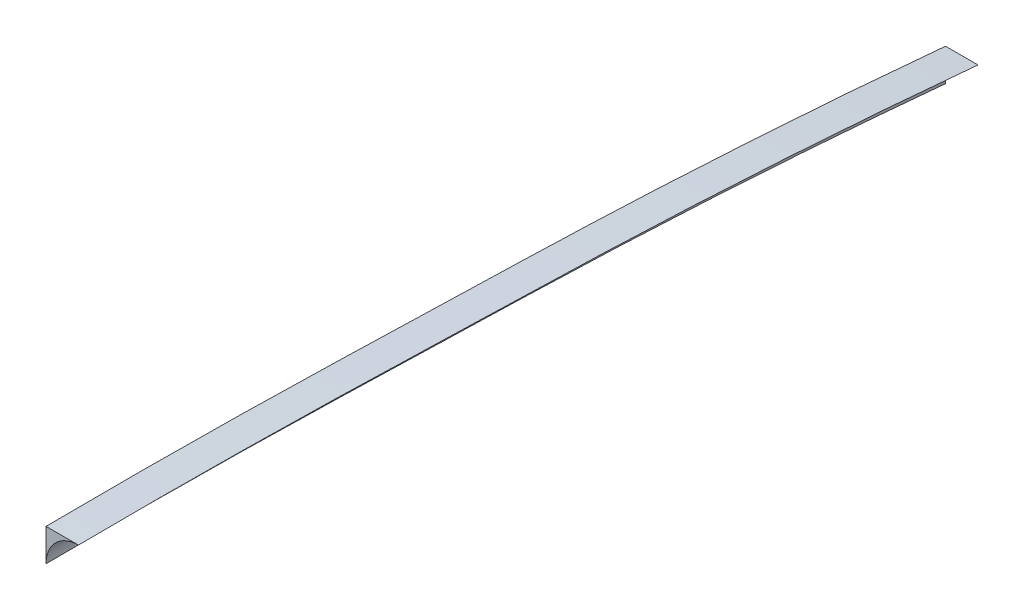
ISO-10303-21;
HEADER;
FILE_DESCRIPTION(('STEP AP214'),'2;1');
FILE_NAME('part.step','',(''),(''),'','','');
FILE_SCHEMA(('AUTOMOTIVE_DESIGN { 1 0 10303 214 1 1 1 1 }'));
ENDSEC;
DATA;
#1=APPLICATION_CONTEXT('core data for automotive mechanical design processes');
#2=APPLICATION_PROTOCOL_DEFINITION('international standard','automotive_design',2000,#1);
#3=PRODUCT_CONTEXT('',#1,'mechanical');
#4=PRODUCT('Part','Part','',(#3));
#5=PRODUCT_RELATED_PRODUCT_CATEGORY('part','',(#4));
#6=PRODUCT_DEFINITION_FORMATION('','',#4);
#7=PRODUCT_DEFINITION_CONTEXT('part definition',#1,'design');
#8=PRODUCT_DEFINITION('design','',#6,#7);
#9=PRODUCT_DEFINITION_SHAPE('','',#8);
#10=(LENGTH_UNIT() NAMED_UNIT(*) SI_UNIT(.MILLI.,.METRE.));
#11=(NAMED_UNIT(*) PLANE_ANGLE_UNIT() SI_UNIT($,.RADIAN.));
#12=(NAMED_UNIT(*) SI_UNIT($,.STERADIAN.) SOLID_ANGLE_UNIT());
#13=UNCERTAINTY_MEASURE_WITH_UNIT(LENGTH_MEASURE(1.E-05),#10,'distance_accuracy_value','');
#14=(GEOMETRIC_REPRESENTATION_CONTEXT(3) GLOBAL_UNCERTAINTY_ASSIGNED_CONTEXT((#13)) GLOBAL_UNIT_ASSIGNED_CONTEXT((#10,
#11,#12)) REPRESENTATION_CONTEXT('',''));
#15=CARTESIAN_POINT('',(0.,0.,0.));
#16=DIRECTION('',(0.,0.,1.));
#17=DIRECTION('',(1.,0.,0.));
#18=AXIS2_PLACEMENT_3D('',#15,#16,#17);
#19=CARTESIAN_POINT('',(545.921789204401,117.985789350297,0.));
#20=DIRECTION('',(0.,0.,-1.));
#21=DIRECTION('',(-1.,0.,0.));
#22=AXIS2_PLACEMENT_3D('',#19,#20,#21);
#23=PLANE('',#22);
#24=DIRECTION('',(0.,-1.,0.));
#25=VECTOR('',#24,1.);
#26=CARTESIAN_POINT('',(469.721789204401,194.185789350297,0.));
#27=LINE('',#26,#25);
#28=CARTESIAN_POINT('',(469.721789204401,194.185789350297,0.));
#29=VERTEX_POINT('',#28);
#30=CARTESIAN_POINT('',(469.721789204401,117.985789350297,0.));
#31=VERTEX_POINT('',#30);
#32=EDGE_CURVE('E294',#29,#31,#27,.T.);
#33=ORIENTED_EDGE('',*,*,#32,.T.);
#34=CARTESIAN_POINT('',(545.921789204401,117.985789350297,0.));
#35=DIRECTION('',(0.,0.,-1.));
#36=DIRECTION('',(-1.,0.,0.));
#37=AXIS2_PLACEMENT_3D('',#34,#35,#36);
#38=CIRCLE('',#37,76.2);
#39=CARTESIAN_POINT('',(545.921789204401,194.185789350297,0.));
#40=VERTEX_POINT('',#39);
#41=EDGE_CURVE('E69',#31,#40,#38,.T.);
#42=ORIENTED_EDGE('',*,*,#41,.T.);
#43=DIRECTION('',(1.,0.,0.));
#44=VECTOR('',#43,1.);
#45=CARTESIAN_POINT('',(469.721789204401,194.185789350297,0.));
#46=LINE('',#45,#44);
#47=EDGE_CURVE('E13',#29,#40,#46,.T.);
#48=ORIENTED_EDGE('',*,*,#47,.F.);
#49=EDGE_LOOP('',(#33,#42,#48));
#50=FACE_BOUND('',#49,.T.);
#51=ADVANCED_FACE('F59',(#50),#23,.F.);
#52=CARTESIAN_POINT('',(606.952202442193,99.1964787102207,-2052.91158045471));
#53=DIRECTION('',(0.,0.,-1.));
#54=DIRECTION('',(-1.,0.,0.));
#55=AXIS2_PLACEMENT_3D('',#52,#53,#54);
#56=PLANE('',#55);
#57=DIRECTION('',(0.,1.,0.));
#58=VECTOR('',#57,1.);
#59=CARTESIAN_POINT('',(530.752202442193,99.1964787102207,-2052.91158045471));
#60=LINE('',#59,#58);
#61=CARTESIAN_POINT('',(530.752202442193,99.1964787102207,-2052.91158045471));
#62=VERTEX_POINT('',#61);
#63=CARTESIAN_POINT('',(530.752202442193,175.396478710221,-2052.91158045471));
#64=VERTEX_POINT('',#63);
#65=EDGE_CURVE('E113',#62,#64,#60,.T.);
#66=ORIENTED_EDGE('',*,*,#65,.T.);
#67=DIRECTION('',(1.,0.,0.));
#68=VECTOR('',#67,1.);
#69=CARTESIAN_POINT('',(530.752202442193,175.396478710221,-2052.91158045471));
#70=LINE('',#69,#68);
#71=CARTESIAN_POINT('',(606.952202442193,175.396478710221,-2052.91158045471));
#72=VERTEX_POINT('',#71);
#73=EDGE_CURVE('E115',#64,#72,#70,.T.);
#74=ORIENTED_EDGE('',*,*,#73,.T.);
#75=CARTESIAN_POINT('',(606.952202442193,99.1964787102207,-2052.91158045471));
#76=DIRECTION('',(0.,0.,-1.));
#77=DIRECTION('',(-1.,0.,0.));
#78=AXIS2_PLACEMENT_3D('',#75,#76,#77);
#79=CIRCLE('',#78,76.2);
#80=EDGE_CURVE('E109',#62,#72,#79,.T.);
#81=ORIENTED_EDGE('',*,*,#80,.F.);
#82=EDGE_LOOP('',(#66,#74,#81));
#83=FACE_BOUND('',#82,.T.);
#84=ADVANCED_FACE('F112',(#83),#56,.T.);
#85=CARTESIAN_POINT('',(606.952202442193,175.396478710221,-2052.91158045471));
#86=CARTESIAN_POINT('',(597.464547328168,196.648576170798,-1733.7704175225));
#87=CARTESIAN_POINT('',(587.953483294164,207.342137513869,-1413.8418366398));
#88=CARTESIAN_POINT('',(578.365977115273,207.456856747076,-1091.3419317868));
#89=CARTESIAN_POINT('',(574.252610761736,207.469413360218,-952.978499952785));
#90=CARTESIAN_POINT('',(570.139262892897,207.457359859277,-814.615689898086));
#91=CARTESIAN_POINT('',(565.412403861013,207.457360723041,-655.615887489399));
#92=CARTESIAN_POINT('',(564.03103429574,207.391875988301,-609.150044854702));
#93=CARTESIAN_POINT('',(561.976860409547,206.997951277331,-540.052735242805));
#94=CARTESIAN_POINT('',(559.89645176314,206.307770136156,-470.072953430643));
#95=CARTESIAN_POINT('',(557.815264149407,205.337340078487,-400.066969091578));
#96=CARTESIAN_POINT('',(555.079753007234,203.68048595181,-308.051165751863));
#97=CARTESIAN_POINT('',(552.285906540067,201.410223066285,-214.073106909113));
#98=CARTESIAN_POINT('',(549.041099165567,198.102742954017,-104.925842749162));
#99=CARTESIAN_POINT('',(547.127324650602,195.790355069093,-40.5512194143467));
#100=CARTESIAN_POINT('',(545.921789204401,194.185789350297,0.));
#101=CARTESIAN_POINT('',(600.602202442193,175.396478710221,-2052.91158045471));
#102=CARTESIAN_POINT('',(591.117263261857,196.642492550902,-1733.86177478892));
#103=CARTESIAN_POINT('',(581.608928578862,207.336024740864,-1414.02500249796));
#104=CARTESIAN_POINT('',(572.02416240063,207.456830018415,-1091.6172644645));
#105=CARTESIAN_POINT('',(567.911973035203,207.47005277956,-953.293423588407));
#106=CARTESIAN_POINT('',(563.799803135119,207.457359918537,-814.97023747805));
#107=CARTESIAN_POINT('',(559.074297212659,207.457360710331,-656.01595031099));
#108=CARTESIAN_POINT('',(557.692153066331,207.393096054147,-609.524052692682));
#109=CARTESIAN_POINT('',(555.635317012544,206.999940469849,-540.337194372342));
#110=CARTESIAN_POINT('',(553.554427471305,206.311068899495,-470.341236451933));
#111=CARTESIAN_POINT('',(551.472823355752,205.341162454095,-400.321242025717));
#112=CARTESIAN_POINT('',(548.733478292003,203.683075454838,-308.176475082699));
#113=CARTESIAN_POINT('',(545.940675883788,201.414447250556,-214.233535790984));
#114=CARTESIAN_POINT('',(542.691319305683,198.10285752594,-104.933247716103));
#115=CARTESIAN_POINT('',(540.777974415768,195.791036470393,-40.5730759013682));
#116=CARTESIAN_POINT('',(539.571789204401,194.185789350297,0.));
#117=CARTESIAN_POINT('',(587.902202442192,175.396478710221,-2052.91158045471));
#118=CARTESIAN_POINT('',(578.422695129234,196.630325311112,-1734.04448932174));
#119=CARTESIAN_POINT('',(568.919819148257,207.323799194853,-1414.39133421427));
#120=CARTESIAN_POINT('',(559.340532971343,207.456776561093,-1092.16792981989));
#121=CARTESIAN_POINT('',(555.230697582137,207.471331618244,-953.92327085965));
#122=CARTESIAN_POINT('',(551.120883619562,207.457360037057,-815.679332637977));
#123=CARTESIAN_POINT('',(546.398083915949,207.457360684912,-656.816075954172));
#124=CARTESIAN_POINT('',(545.014390607512,207.395536185838,-610.272068368642));
#125=CARTESIAN_POINT('',(542.952230218539,207.003918854886,-540.906112631415));
#126=CARTESIAN_POINT('',(540.870378887634,206.317666426173,-470.877802494514));
#127=CARTESIAN_POINT('',(538.787941768443,205.348807205312,-400.829787893996));
#128=CARTESIAN_POINT('',(536.040928861542,203.688254460892,-308.427093744372));
#129=CARTESIAN_POINT('',(533.25021457123,201.422895619096,-214.554393554726));
#130=CARTESIAN_POINT('',(529.991759585914,198.103086669787,-104.948057649984));
#131=CARTESIAN_POINT('',(528.079273946101,195.792399272991,-40.6167888754111));
#132=CARTESIAN_POINT('',(526.871789204401,194.185789350297,0.));
#133=CARTESIAN_POINT('',(568.852202442193,175.39647871022,-2052.91158045471));
#134=CARTESIAN_POINT('',(559.380842930301,196.612074451425,-1734.31856112098));
#135=CARTESIAN_POINT('',(549.886155002349,207.305460875837,-1414.94083178873));
#136=CARTESIAN_POINT('',(540.315088827412,207.456696375109,-1092.99392785298));
#137=CARTESIAN_POINT('',(536.208784402539,207.47324987627,-954.868041766516));
#138=CARTESIAN_POINT('',(532.102504346226,207.457360214836,-816.742975377869));
#139=CARTESIAN_POINT('',(527.383763970884,207.457360646782,-658.016264418945));
#140=CARTESIAN_POINT('',(525.997746919284,207.399196383374,-611.394091882581));
#141=CARTESIAN_POINT('',(523.927600027532,207.00988643244,-541.759490020026));
#142=CARTESIAN_POINT('',(521.844306012129,206.32756271619,-471.682651558386));
#143=CARTESIAN_POINT('',(519.760619387479,205.360274332136,-401.592606696413));
#144=CARTESIAN_POINT('',(517.002104715849,203.696022969975,-308.803021736881));
#145=CARTESIAN_POINT('',(514.214522602392,201.435568171907,-215.035680200339));
#146=CARTESIAN_POINT('',(510.94242000626,198.103430385556,-104.970272550805));
#147=CARTESIAN_POINT('',(509.0312232416,195.794443476888,-40.6823583364756));
#148=CARTESIAN_POINT('',(507.821789204401,194.185789350297,0.));
#149=CARTESIAN_POINT('',(549.802202442192,175.396478710221,-2052.91158045471));
#150=CARTESIAN_POINT('',(540.338990731367,196.593823591739,-1734.59263292021));
#151=CARTESIAN_POINT('',(530.852490856442,207.287122556821,-1415.4903293632));
#152=CARTESIAN_POINT('',(521.289644683482,207.456616189126,-1093.81992588607));
#153=CARTESIAN_POINT('',(517.186871222941,207.475168134296,-955.81281267338));
#154=CARTESIAN_POINT('',(513.084125072892,207.457360392616,-817.80661811776));
#155=CARTESIAN_POINT('',(508.36944402582,207.457360608653,-659.216452883718));
#156=CARTESIAN_POINT('',(506.981103231057,207.402856580911,-612.51611539652));
#157=CARTESIAN_POINT('',(504.902969836525,207.015854009995,-542.612867408635));
#158=CARTESIAN_POINT('',(502.818233136624,206.337459006207,-472.487500622258));
#159=CARTESIAN_POINT('',(500.733297006516,205.371741458961,-402.35542549883));
#160=CARTESIAN_POINT('',(497.963280570158,203.703791479056,-309.17894972939));
#161=CARTESIAN_POINT('',(495.178830633556,201.448240724718,-215.516966845952));
#162=CARTESIAN_POINT('',(491.893080426607,198.103774101326,-104.992487451626));
#163=CARTESIAN_POINT('',(489.983172537101,195.796487680785,-40.74792779754));
#164=CARTESIAN_POINT('',(488.771789204402,194.185789350296,0.));
#165=CARTESIAN_POINT('',(537.102202442192,175.396478710221,-2052.91158045471));
#166=CARTESIAN_POINT('',(527.644422598744,196.581656351948,-1734.77534745304));
#167=CARTESIAN_POINT('',(518.163381425837,207.274897010811,-1415.85666107951));
#168=CARTESIAN_POINT('',(508.606015254195,207.456562731804,-1094.37059124147));
#169=CARTESIAN_POINT('',(504.505595769875,207.47644697298,-956.442659944624));
#170=CARTESIAN_POINT('',(500.405205557335,207.457360511136,-818.515713277688));
#171=CARTESIAN_POINT('',(495.69323072911,207.457360583233,-660.0165785269));
#172=CARTESIAN_POINT('',(494.303340772237,207.405296712602,-613.26413107248));
#173=CARTESIAN_POINT('',(492.219883042519,207.019832395032,-543.181785667709));
#174=CARTESIAN_POINT('',(490.134184552954,206.344056532885,-473.024066664839));
#175=CARTESIAN_POINT('',(488.048415419207,205.379386210177,-402.863971367108));
#176=CARTESIAN_POINT('',(485.270731139697,203.708970485111,-309.429568391062));
#177=CARTESIAN_POINT('',(482.488369320997,201.456689093259,-215.837824609694));
#178=CARTESIAN_POINT('',(479.193520706838,198.104003245173,-105.007297385507));
#179=CARTESIAN_POINT('',(477.284472067433,195.797850483384,-40.791640771583));
#180=CARTESIAN_POINT('',(476.071789204401,194.185789350297,0.));
#181=CARTESIAN_POINT('',(530.752202442193,175.396478710221,-2052.91158045471));
#182=CARTESIAN_POINT('',(521.297138532433,196.575572732053,-1734.86670471945));
#183=CARTESIAN_POINT('',(511.818826710535,207.268784237805,-1416.03982693767));
#184=CARTESIAN_POINT('',(502.264200539552,207.456536003142,-1094.64592391917));
#185=CARTESIAN_POINT('',(498.164958043342,207.477086392322,-956.757583580245));
#186=CARTESIAN_POINT('',(494.065745799556,207.457360570396,-818.870260857652));
#187=CARTESIAN_POINT('',(489.355124080755,207.457360570523,-660.416641348491));
#188=CARTESIAN_POINT('',(487.964459542828,207.406516778447,-613.638138910459));
#189=CARTESIAN_POINT('',(485.878339645517,207.02182158755,-543.466244797246));
#190=CARTESIAN_POINT('',(483.792160261119,206.347355296224,-473.292349686129));
#191=CARTESIAN_POINT('',(481.705974625553,205.383208585786,-403.118244301247));
#192=CARTESIAN_POINT('',(478.924456424466,203.711559988139,-309.554877721899));
#193=CARTESIAN_POINT('',(476.143138664718,201.460913277529,-215.998253491565));
#194=CARTESIAN_POINT('',(472.843740846953,198.104117817096,-105.014702352447));
#195=CARTESIAN_POINT('',(470.9351218326,195.798531884683,-40.8134972586045));
#196=CARTESIAN_POINT('',(469.721789204401,194.185789350297,0.));
#197=B_SPLINE_SURFACE_WITH_KNOTS('',3,3,((#85,#86,#87,#88,#89,#90,#91,#92,#93,#94,#95,#96,#97,
#98,#99,#100),(#101,#102,#103,#104,#105,#106,#107,#108,#109,#110,#111,#112,#113,#114,#115,#116),
(#117,#118,#119,#120,#121,#122,#123,#124,#125,#126,#127,#128,#129,#130,#131,#132),(#133,#134,
#135,#136,#137,#138,#139,#140,#141,#142,#143,#144,#145,#146,#147,#148),(#149,#150,#151,#152,
#153,#154,#155,#156,#157,#158,#159,#160,#161,#162,#163,#164),(#165,#166,#167,#168,#169,#170,
#171,#172,#173,#174,#175,#176,#177,#178,#179,#180),(#181,#182,#183,#184,#185,#186,#187,#188,
#189,#190,#191,#192,#193,#194,#195,#196)),.UNSPECIFIED.,.F.,.F.,.F.,(4,1,1,1,4),(4,2,1,2,1,1,1,
1,1,1,1,4),(0.611015470351657,0.708261602763743,0.805507735175829,0.902753867587914,1.),(0.,
0.465470718975693,0.46959545321619,0.666944463198287,0.701118757814173,0.735293052430059,
0.769467347045946,0.803641641661832,0.837815936277718,0.906164525509491,0.940338820125378,1.),.UNSPECIFIED.);
#198=CARTESIAN_POINT('',(530.752202442193,175.396478710221,-2052.91158045471));
#199=CARTESIAN_POINT('',(521.297138532433,196.575572732053,-1734.86670471945));
#200=CARTESIAN_POINT('',(511.818826710535,207.268784237805,-1416.03982693767));
#201=CARTESIAN_POINT('',(502.264200539552,207.456536003142,-1094.64592391917));
#202=CARTESIAN_POINT('',(498.164958043342,207.477086392322,-956.757583580245));
#203=CARTESIAN_POINT('',(494.065745799556,207.457360570396,-818.870260857652));
#204=CARTESIAN_POINT('',(489.355124080755,207.457360570523,-660.416641348491));
#205=CARTESIAN_POINT('',(487.964459542828,207.406516778447,-613.638138910459));
#206=CARTESIAN_POINT('',(485.878339645517,207.02182158755,-543.466244797246));
#207=CARTESIAN_POINT('',(483.792160261119,206.347355296224,-473.292349686129));
#208=CARTESIAN_POINT('',(481.705974625553,205.383208585786,-403.118244301247));
#209=CARTESIAN_POINT('',(478.924456424466,203.711559988139,-309.554877721899));
#210=CARTESIAN_POINT('',(476.143138664718,201.460913277529,-215.998253491565));
#211=CARTESIAN_POINT('',(472.843740846953,198.104117817096,-105.014702352447));
#212=CARTESIAN_POINT('',(470.9351218326,195.798531884683,-40.8134972586045));
#213=CARTESIAN_POINT('',(469.721789204401,194.185789350297,0.));
#214=B_SPLINE_CURVE_WITH_KNOTS('',3,(#198,#199,#200,#201,#202,#203,#204,#205,#206,#207,#208,
#209,#210,#211,#212,#213),.UNSPECIFIED.,.F.,.F.,(4,2,1,2,1,1,1,1,1,1,1,4),(0.,0.465470718975693,
0.46959545321619,0.666944463198287,0.701118757814173,0.735293052430059,0.769467347045946,
0.803641641661832,0.837815936277718,0.906164525509491,0.940338820125378,1.),.UNSPECIFIED.);
#215=CARTESIAN_POINT('',(502.096354504108,207.457360570469,-1089.));
#216=VERTEX_POINT('',#215);
#217=EDGE_CURVE('E131',#64,#216,#214,.T.);
#218=CARTESIAN_POINT('',(530.752202442193,175.396478710221,-2052.91158045471));
#219=CARTESIAN_POINT('',(521.297138532433,196.575572732053,-1734.86670471945));
#220=CARTESIAN_POINT('',(511.818826710535,207.268784237805,-1416.03982693767));
#221=CARTESIAN_POINT('',(502.264200539552,207.456536003142,-1094.64592391917));
#222=CARTESIAN_POINT('',(498.164958043342,207.477086392322,-956.757583580245));
#223=CARTESIAN_POINT('',(494.065745799556,207.457360570396,-818.870260857652));
#224=CARTESIAN_POINT('',(489.355124080755,207.457360570523,-660.416641348491));
#225=CARTESIAN_POINT('',(487.964459542828,207.406516778447,-613.638138910459));
#226=CARTESIAN_POINT('',(485.878339645517,207.02182158755,-543.466244797246));
#227=CARTESIAN_POINT('',(483.792160261119,206.347355296224,-473.292349686129));
#228=CARTESIAN_POINT('',(481.705974625553,205.383208585786,-403.118244301247));
#229=CARTESIAN_POINT('',(478.924456424466,203.711559988139,-309.554877721899));
#230=CARTESIAN_POINT('',(476.143138664718,201.460913277529,-215.998253491565));
#231=CARTESIAN_POINT('',(472.843740846953,198.104117817096,-105.014702352447));
#232=CARTESIAN_POINT('',(470.9351218326,195.798531884683,-40.8134972586045));
#233=CARTESIAN_POINT('',(469.721789204401,194.185789350297,0.));
#234=B_SPLINE_CURVE_WITH_KNOTS('',3,(#218,#219,#220,#221,#222,#223,#224,#225,#226,#227,#228,
#229,#230,#231,#232,#233),.UNSPECIFIED.,.F.,.F.,(4,2,1,2,1,1,1,1,1,1,1,4),(0.,0.465470718975693,
0.46959545321619,0.666944463198287,0.701118757814173,0.735293052430059,0.769467347045946,
0.803641641661832,0.837815936277718,0.906164525509491,0.940338820125378,1.),.UNSPECIFIED.);
#235=CARTESIAN_POINT('',(489.689698333859,207.457360570515,-671.670888571792));
#236=VERTEX_POINT('',#235);
#237=EDGE_CURVE('E319',#216,#236,#234,.T.);
#238=CARTESIAN_POINT('',(530.752202442193,175.396478710221,-2052.91158045471));
#239=CARTESIAN_POINT('',(521.297138532433,196.575572732053,-1734.86670471945));
#240=CARTESIAN_POINT('',(511.818826710535,207.268784237805,-1416.03982693767));
#241=CARTESIAN_POINT('',(502.264200539552,207.456536003142,-1094.64592391917));
#242=CARTESIAN_POINT('',(498.164958043342,207.477086392322,-956.757583580245));
#243=CARTESIAN_POINT('',(494.065745799556,207.457360570396,-818.870260857652));
#244=CARTESIAN_POINT('',(489.355124080755,207.457360570523,-660.416641348491));
#245=CARTESIAN_POINT('',(487.964459542828,207.406516778447,-613.638138910459));
#246=CARTESIAN_POINT('',(485.878339645517,207.02182158755,-543.466244797246));
#247=CARTESIAN_POINT('',(483.792160261119,206.347355296224,-473.292349686129));
#248=CARTESIAN_POINT('',(481.705974625553,205.383208585786,-403.118244301247));
#249=CARTESIAN_POINT('',(478.924456424466,203.711559988139,-309.554877721899));
#250=CARTESIAN_POINT('',(476.143138664718,201.460913277529,-215.998253491565));
#251=CARTESIAN_POINT('',(472.843740846953,198.104117817096,-105.014702352447));
#252=CARTESIAN_POINT('',(470.9351218326,195.798531884683,-40.8134972586045));
#253=CARTESIAN_POINT('',(469.721789204401,194.185789350297,0.));
#254=B_SPLINE_CURVE_WITH_KNOTS('',3,(#238,#239,#240,#241,#242,#243,#244,#245,#246,#247,#248,
#249,#250,#251,#252,#253),.UNSPECIFIED.,.F.,.F.,(4,2,1,2,1,1,1,1,1,1,1,4),(0.,0.465470718975693,
0.46959545321619,0.666944463198287,0.701118757814173,0.735293052430059,0.769467347045946,
0.803641641661832,0.837815936277718,0.906164525509491,0.940338820125378,1.),.UNSPECIFIED.);
#255=EDGE_CURVE('E192',#236,#29,#254,.T.);
#256=CARTESIAN_POINT('',(606.952202442193,175.396478710221,-2052.91158045471));
#257=CARTESIAN_POINT('',(597.464547328168,196.648576170798,-1733.7704175225));
#258=CARTESIAN_POINT('',(587.953483294164,207.342137513869,-1413.8418366398));
#259=CARTESIAN_POINT('',(578.365977115273,207.456856747076,-1091.3419317868));
#260=CARTESIAN_POINT('',(574.252610761736,207.469413360218,-952.978499952785));
#261=CARTESIAN_POINT('',(570.139262892897,207.457359859277,-814.615689898086));
#262=CARTESIAN_POINT('',(565.412403861013,207.457360723041,-655.615887489399));
#263=CARTESIAN_POINT('',(564.03103429574,207.391875988301,-609.150044854702));
#264=CARTESIAN_POINT('',(561.976860409547,206.997951277331,-540.052735242805));
#265=CARTESIAN_POINT('',(559.89645176314,206.307770136156,-470.072953430643));
#266=CARTESIAN_POINT('',(557.815264149407,205.337340078487,-400.066969091578));
#267=CARTESIAN_POINT('',(555.079753007234,203.68048595181,-308.051165751863));
#268=CARTESIAN_POINT('',(552.285906540067,201.410223066285,-214.073106909113));
#269=CARTESIAN_POINT('',(549.041099165567,198.102742954017,-104.925842749162));
#270=CARTESIAN_POINT('',(547.127324650602,195.790355069093,-40.5512194143467));
#271=CARTESIAN_POINT('',(545.921789204401,194.185789350297,0.));
#272=B_SPLINE_CURVE_WITH_KNOTS('',3,(#256,#257,#258,#259,#260,#261,#262,#263,#264,#265,#266,
#267,#268,#269,#270,#271),.UNSPECIFIED.,.F.,.F.,(4,2,1,2,1,1,1,1,1,1,1,4),(0.,0.465470718975693,
0.46959545321619,0.666944463198287,0.701118757814173,0.735293052430059,0.769467347045946,
0.803641641661832,0.837815936277718,0.906164525509491,0.940338820125378,1.),.UNSPECIFIED.);
#273=EDGE_CURVE('E84',#72,#40,#272,.T.);
#274=ORIENTED_EDGE('',*,*,#73,.F.);
#275=ORIENTED_EDGE('',*,*,#217,.T.);
#276=ORIENTED_EDGE('',*,*,#237,.T.);
#277=ORIENTED_EDGE('',*,*,#255,.T.);
#278=ORIENTED_EDGE('',*,*,#47,.T.);
#279=ORIENTED_EDGE('',*,*,#273,.F.);
#280=EDGE_LOOP('',(#274,#275,#276,#277,#278,#279));
#281=FACE_BOUND('',#280,.T.);
#282=ADVANCED_FACE('F161',(#281),#197,.T.);
#283=CARTESIAN_POINT('',(530.752202442193,99.1964787102207,-2052.91158045471));
#284=CARTESIAN_POINT('',(521.213353184223,120.563249704221,-1732.04837362043));
#285=CARTESIAN_POINT('',(511.650842095749,131.257360570469,-1410.38924155358));
#286=CARTESIAN_POINT('',(502.011688121212,131.257360570469,-1086.15203308152));
#287=CARTESIAN_POINT('',(497.876136064463,131.257360589575,-947.042329272119));
#288=CARTESIAN_POINT('',(493.740584007714,131.257358742255,-807.93262546271));
#289=CARTESIAN_POINT('',(488.988219464083,131.257360962615,-648.07488096169));
#290=CARTESIAN_POINT('',(487.621450407712,131.168878288919,-602.100163197609));
#291=CARTESIAN_POINT('',(485.617457198439,130.76045588172,-534.69080697321));
#292=CARTESIAN_POINT('',(483.546113206071,130.045589912126,-465.015937618027));
#293=CARTESIAN_POINT('',(481.472776466675,129.065289995706,-395.27403720019));
#294=CARTESIAN_POINT('',(478.80953304365,127.431674969688,-305.689140512772));
#295=CARTESIAN_POINT('',(475.99600652889,125.130599068659,-211.049093728855));
#296=CARTESIAN_POINT('',(472.83694962215,121.900583324143,-104.786262410722));
#297=CARTESIAN_POINT('',(470.91507686576,119.5775109572,-40.1392343399868));
#298=CARTESIAN_POINT('',(469.721789204401,117.985789350297,0.));
#299=CARTESIAN_POINT('',(530.752202442193,104.183757015344,-2052.91158045471));
#300=CARTESIAN_POINT('',(521.215486273554,125.545749945452,-1732.12012544968));
#301=CARTESIAN_POINT('',(511.65511881235,136.239837914901,-1410.53309968217));
#302=CARTESIAN_POINT('',(502.018116829298,136.244617882951,-1086.36827886091));
#303=CARTESIAN_POINT('',(497.883489176849,136.245141093475,-947.289669717147));
#304=CARTESIAN_POINT('',(493.748862294597,136.244637093921,-808.211086480851));
#305=CARTESIAN_POINT('',(488.997560480622,136.244639257756,-648.389089567012));
#306=CARTESIAN_POINT('',(487.630183069713,136.157114831517,-602.393908266654));
#307=CARTESIAN_POINT('',(485.624098998902,135.749296494994,-534.914220651109));
#308=CARTESIAN_POINT('',(483.552377312616,135.035459059917,-465.226646610219));
#309=CARTESIAN_POINT('',(481.478713453456,134.055570387612,-395.473742695664));
#310=CARTESIAN_POINT('',(478.812458875466,132.420987065733,-305.787558231068));
#311=CARTESIAN_POINT('',(475.999752362689,130.121195040351,-211.175094278033));
#312=CARTESIAN_POINT('',(472.837122519793,126.887951613844,-104.792078258157));
#313=CARTESIAN_POINT('',(470.915587190129,124.565324433653,-40.1564003847518));
#314=CARTESIAN_POINT('',(469.721789204401,122.97306765542,0.));
#315=CARTESIAN_POINT('',(531.734316860685,114.158194508065,-2052.91158045472));
#316=CARTESIAN_POINT('',(522.201866870709,135.510631310388,-1732.26362910819));
#317=CARTESIAN_POINT('',(512.645786664043,146.204673486238,-1410.82081593936));
#318=CARTESIAN_POINT('',(503.013088663962,146.21901339039,-1086.80077041968));
#319=CARTESIAN_POINT('',(498.880309820114,146.22058298375,-947.784350607204));
#320=CARTESIAN_POINT('',(494.747533286854,146.219074679727,-808.768008517133));
#321=CARTESIAN_POINT('',(489.998356932192,146.219076730513,-649.017506777655));
#322=CARTESIAN_POINT('',(488.629762812207,146.133468799187,-602.981398404746));
#323=CARTESIAN_POINT('',(486.61949701832,145.726858604016,-535.36104800691));
#324=CARTESIAN_POINT('',(484.547019944197,145.015078237974,-465.648064594604));
#325=CARTESIAN_POINT('',(482.472701845509,144.036012053898,-395.873153686614));
#326=CARTESIAN_POINT('',(479.80042495759,142.399492140298,-305.984393667659));
#327=CARTESIAN_POINT('',(476.98935844878,140.102267866207,-211.427095376388));
#328=CARTESIAN_POINT('',(473.819582733569,136.862569075721,-104.803709953027));
#329=CARTESIAN_POINT('',(471.898722257358,134.540832269031,-40.1907324742818));
#330=CARTESIAN_POINT('',(470.703903622893,132.947505148141,0.));
#331=CARTESIAN_POINT('',(536.098687258916,128.544995487672,-2052.91158045471));
#332=CARTESIAN_POINT('',(526.572636536932,149.883098098317,-1732.47888459595));
#333=CARTESIAN_POINT('',(517.022987212076,160.57707158377,-1411.25239032514));
#334=CARTESIAN_POINT('',(507.39674518645,160.605751392072,-1087.44950775784));
#335=CARTESIAN_POINT('',(503.266739555504,160.608890559687,-948.526371942285));
#336=CARTESIAN_POINT('',(499.136738545733,160.605875798962,-809.603391571554));
#337=CARTESIAN_POINT('',(494.390750380039,160.605877680173,-649.960132593617));
#338=CARTESIAN_POINT('',(493.020331196442,160.523144491216,-603.862633611882));
#339=CARTESIAN_POINT('',(491.003792817939,160.118346508074,-536.031289040608));
#340=CARTESIAN_POINT('',(488.930182662061,159.409651745584,-466.280191571181));
#341=CARTESIAN_POINT('',(486.854883204081,158.431819293853,-396.472270173037));
#342=CARTESIAN_POINT('',(484.173572851268,156.79239449267,-306.279646822545));
#343=CARTESIAN_POINT('',(481.364966348407,154.499021845517,-211.80509702392));
#344=CARTESIAN_POINT('',(478.184471824727,151.249640009062,-104.821157495332));
#345=CARTESIAN_POINT('',(476.264623628693,148.929238762625,-40.2422306085767));
#346=CARTESIAN_POINT('',(475.068274021124,147.334306127748,0.));
#347=CARTESIAN_POINT('',(543.185633192548,141.803916272323,-2052.91158045471));
#348=CARTESIAN_POINT('',(533.665981738558,163.12768469129,-1732.69414008371));
#349=CARTESIAN_POINT('',(524.12276329551,173.821589486346,-1411.68396471091));
#350=CARTESIAN_POINT('',(514.502977244341,173.864609198799,-1088.098245096));
#351=CARTESIAN_POINT('',(510.375744826296,173.869317940668,-949.268393277368));
#352=CARTESIAN_POINT('',(506.248519340013,173.864796723241,-810.438774625976));
#353=CARTESIAN_POINT('',(501.505719363288,173.864798434877,-650.902758409581));
#354=CARTESIAN_POINT('',(500.133475116078,173.78493998829,-604.743868819019));
#355=CARTESIAN_POINT('',(498.11066415296,173.381954217177,-536.701530074308));
#356=CARTESIAN_POINT('',(496.035920915328,172.67634505824,-466.912318547757));
#357=CARTESIAN_POINT('',(493.959640098056,171.699746338852,-397.07138665946));
#358=CARTESIAN_POINT('',(491.26929628035,170.057416650086,-306.574899977431));
#359=CARTESIAN_POINT('',(488.463149783438,167.767895629872,-212.183098671452));
#360=CARTESIAN_POINT('',(485.271936451288,164.508830747448,-104.838605037637));
#361=CARTESIAN_POINT('',(483.353100535432,162.189765061263,-40.2937287428717));
#362=CARTESIAN_POINT('',(482.155219954758,160.593226912399,0.));
#363=CARTESIAN_POINT('',(552.723236569163,153.425444583251,-2052.91158045471));
#364=CARTESIAN_POINT('',(543.209984383166,174.73487881054,-1732.90939557147));
#365=CARTESIAN_POINT('',(533.673196821926,185.428714915199,-1412.11553909669));
#366=CARTESIAN_POINT('',(524.059866745212,185.486074531803,-1088.74698243416));
#367=CARTESIAN_POINT('',(519.935407540069,185.492352847926,-950.010414612452));
#368=CARTESIAN_POINT('',(515.810957577275,185.486325173796,-811.274157680398));
#369=CARTESIAN_POINT('',(511.071345789517,185.486326715858,-651.845384225544));
#370=CARTESIAN_POINT('',(509.697276478695,185.40934301164,-605.625104026155));
#371=CARTESIAN_POINT('',(507.668192930962,185.008169452556,-537.371771108007));
#372=CARTESIAN_POINT('',(505.592316611574,184.305645897171,-467.544445524334));
#373=CARTESIAN_POINT('',(503.51505443501,183.330280910127,-397.670503145884));
#374=CARTESIAN_POINT('',(500.81567715241,181.685046333779,-306.870153132317));
#375=CARTESIAN_POINT('',(498.011990661447,179.399376940502,-212.561100318984));
#376=CARTESIAN_POINT('',(494.810058520827,176.13062901211,-104.856052579942));
#377=CARTESIAN_POINT('',(492.89223488515,173.812898886177,-40.3452268771667));
#378=CARTESIAN_POINT('',(491.69282333137,172.214755223327,0.));
#379=CARTESIAN_POINT('',(564.344764880089,162.963047959866,-2052.91158045471));
#380=CARTESIAN_POINT('',(554.837911962086,184.258147995477,-1733.12465105923));
#381=CARTESIAN_POINT('',(545.307555282656,194.951915409739,-1412.54711348247));
#382=CARTESIAN_POINT('',(535.700681180398,195.023614930494,-1089.39571977232));
#383=CARTESIAN_POINT('',(531.578995188156,195.031462820872,-950.752435947535));
#384=CARTESIAN_POINT('',(527.457320748851,195.023928690039,-812.10954073482));
#385=CARTESIAN_POINT('',(522.720897150062,195.023930062526,-652.788010041508));
#386=CARTESIAN_POINT('',(521.345002775627,194.949821100678,-606.506339233292));
#387=CARTESIAN_POINT('',(519.309646643279,194.550459753622,-538.042012141706));
#388=CARTESIAN_POINT('',(517.232637242137,193.85102180179,-468.176572500911));
#389=CARTESIAN_POINT('',(515.15439370628,192.876890547089,-398.269619632307));
#390=CARTESIAN_POINT('',(512.445982958788,191.22875108316,-307.165406287204));
#391=CARTESIAN_POINT('',(509.644756473774,188.946933316821,-212.939101966516));
#392=CARTESIAN_POINT('',(506.432105524684,185.668502342459,-104.873500122247));
#393=CARTESIAN_POINT('',(504.515294169185,183.352107776779,-40.3967250114617));
#394=CARTESIAN_POINT('',(503.3143516423,181.752358599942,0.));
#395=CARTESIAN_POINT('',(577.603685664742,170.049993893497,-2052.91158045472));
#396=CARTESIAN_POINT('',(568.103232014731,191.33075973743,-1733.33990654699));
#397=CARTESIAN_POINT('',(558.57930621711,202.024458461295,-1412.97868786825));
#398=CARTESIAN_POINT('',(548.978888089307,202.110497886201,-1090.04445711048));
#399=CARTESIAN_POINT('',(544.859975309967,202.119915350834,-951.49445728262));
#400=CARTESIAN_POINT('',(540.74107639415,202.110874763298,-812.944923789243));
#401=CARTESIAN_POINT('',(536.00784098433,202.110875966211,-653.730635857473));
#402=CARTESIAN_POINT('',(534.630121546282,202.039641746732,-607.387574440429));
#403=CARTESIAN_POINT('',(532.588492829319,201.642092611705,-538.712253175407));
#404=CARTESIAN_POINT('',(530.510350346422,200.945740263425,-468.808699477489));
#405=CARTESIAN_POINT('',(528.431125451273,199.972842741068,-398.868736118732));
#406=CARTESIAN_POINT('',(525.713681238887,198.321798389556,-307.46065944209));
#407=CARTESIAN_POINT('',(522.914914759822,196.043832250155,-213.317103614049));
#408=CARTESIAN_POINT('',(519.691545002263,192.755718229824,-104.890947664552));
#409=CARTESIAN_POINT('',(517.775745926941,190.440659224396,-40.4482231457567));
#410=CARTESIAN_POINT('',(516.573272426951,188.839304533573,0.));
#411=CARTESIAN_POINT('',(591.990486644348,174.414364291729,-2052.91158045471));
#412=CARTESIAN_POINT('',(582.49643226233,195.680795943984,-1733.55516203474));
#413=CARTESIAN_POINT('',(572.978937346518,206.374425977452,-1413.41026225402));
#414=CARTESIAN_POINT('',(563.384975193171,206.474805306509,-1090.69319444864));
#415=CARTESIAN_POINT('',(559.268835626732,206.485792345396,-952.236478617701));
#416=CARTESIAN_POINT('',(555.152712234404,206.475245301158,-813.780306843663));
#417=CARTESIAN_POINT('',(550.422665013552,206.475246334496,-654.673261673435));
#418=CARTESIAN_POINT('',(549.043120511891,206.406886857387,-608.268809647565));
#419=CARTESIAN_POINT('',(546.995219210313,206.011149934388,-539.382494209105));
#420=CARTESIAN_POINT('',(544.915943645661,205.317883189661,-469.440826454065));
#421=CARTESIAN_POINT('',(542.83573739122,204.346219399648,-399.467852605154));
#422=CARTESIAN_POINT('',(540.109259713941,202.692270160554,-307.755912596976));
#423=CARTESIAN_POINT('',(537.312953240825,200.41815564809,-213.69510526158));
#424=CARTESIAN_POINT('',(534.078864674795,197.120358581791,-104.908395206857));
#425=CARTESIAN_POINT('',(532.164077879651,194.806635136615,-40.4997212800516));
#426=CARTESIAN_POINT('',(530.960073406556,193.203674931805,0.));
#427=CARTESIAN_POINT('',(601.964924137069,175.396478710221,-2052.91158045471));
#428=CARTESIAN_POINT('',(592.475135933714,196.65335423469,-1733.69866569325));
#429=CARTESIAN_POINT('',(582.96192827244,207.346938474561,-1413.69797851121));
#430=CARTESIAN_POINT('',(573.372270102064,207.456877739718,-1091.12568600741));
#431=CARTESIAN_POINT('',(569.257979344226,207.468911161441,-952.731159507757));
#432=CARTESIAN_POINT('',(565.143706300891,207.457359812735,-814.337228879945));
#433=CARTESIAN_POINT('',(560.415784539351,207.457360733023,-655.301678884078));
#434=CARTESIAN_POINT('',(559.035023328615,207.390917750827,-608.856299785657));
#435=CARTESIAN_POINT('',(556.982940303961,206.996388969181,-539.829321564905));
#436=CARTESIAN_POINT('',(554.902909351472,206.305179293488,-469.86224443845));
#437=CARTESIAN_POINT('',(552.822048857503,205.334337991704,-399.867263596104));
#438=CARTESIAN_POINT('',(550.089548870294,203.678452160889,-307.952748033567));
#439=CARTESIAN_POINT('',(547.294882401144,201.406905399718,-213.947106359935));
#440=CARTESIAN_POINT('',(544.053647962801,198.102652969439,-104.920026901727));
#441=CARTESIAN_POINT('',(542.13953602111,195.789819897765,-40.5340533695817));
#442=CARTESIAN_POINT('',(540.934510899278,194.185789350297,0.));
#443=CARTESIAN_POINT('',(606.952202442193,175.396478710221,-2052.91158045471));
#444=CARTESIAN_POINT('',(597.464547328168,196.648576170798,-1733.7704175225));
#445=CARTESIAN_POINT('',(587.953483294164,207.342137513869,-1413.8418366398));
#446=CARTESIAN_POINT('',(578.365977115273,207.456856747076,-1091.3419317868));
#447=CARTESIAN_POINT('',(574.252610761736,207.469413360218,-952.978499952785));
#448=CARTESIAN_POINT('',(570.139262892897,207.457359859277,-814.615689898086));
#449=CARTESIAN_POINT('',(565.412403861013,207.457360723041,-655.615887489399));
#450=CARTESIAN_POINT('',(564.03103429574,207.391875988301,-609.150044854702));
#451=CARTESIAN_POINT('',(561.976860409547,206.997951277331,-540.052735242805));
#452=CARTESIAN_POINT('',(559.89645176314,206.307770136156,-470.072953430643));
#453=CARTESIAN_POINT('',(557.815264149407,205.337340078487,-400.066969091578));
#454=CARTESIAN_POINT('',(555.079753007234,203.68048595181,-308.051165751863));
#455=CARTESIAN_POINT('',(552.285906540067,201.410223066285,-214.073106909113));
#456=CARTESIAN_POINT('',(549.041099165567,198.102742954017,-104.925842749162));
#457=CARTESIAN_POINT('',(547.127324650602,195.790355069093,-40.5512194143467));
#458=CARTESIAN_POINT('',(545.921789204401,194.185789350297,0.));
#459=B_SPLINE_SURFACE_WITH_KNOTS('',3,3,((#283,#284,#285,#286,#287,#288,#289,#290,#291,#292,
#293,#294,#295,#296,#297,#298),(#299,#300,#301,#302,#303,#304,#305,#306,#307,#308,#309,#310,
#311,#312,#313,#314),(#315,#316,#317,#318,#319,#320,#321,#322,#323,#324,#325,#326,#327,#328,
#329,#330),(#331,#332,#333,#334,#335,#336,#337,#338,#339,#340,#341,#342,#343,#344,#345,#346),
(#347,#348,#349,#350,#351,#352,#353,#354,#355,#356,#357,#358,#359,#360,#361,#362),(#363,#364,
#365,#366,#367,#368,#369,#370,#371,#372,#373,#374,#375,#376,#377,#378),(#379,#380,#381,#382,
#383,#384,#385,#386,#387,#388,#389,#390,#391,#392,#393,#394),(#395,#396,#397,#398,#399,#400,
#401,#402,#403,#404,#405,#406,#407,#408,#409,#410),(#411,#412,#413,#414,#415,#416,#417,#418,
#419,#420,#421,#422,#423,#424,#425,#426),(#427,#428,#429,#430,#431,#432,#433,#434,#435,#436,
#437,#438,#439,#440,#441,#442),(#443,#444,#445,#446,#447,#448,#449,#450,#451,#452,#453,#454,
#455,#456,#457,#458)),.UNSPECIFIED.,.F.,.F.,.F.,(4,1,1,1,1,1,1,1,4),(4,2,1,2,1,1,1,1,1,1,1,4),
(0.,0.0763769337939572,0.152753867587914,0.229130801381871,0.305507735175829,0.381884668969786,
0.458261602763743,0.5346385365577,0.611015470351657),(0.,0.465470718975693,0.46959545321619,
0.666944463198287,0.701118757814173,0.735293052430059,0.769467347045946,0.803641641661832,
0.837815936277718,0.906164525509491,0.940338820125378,1.),.UNSPECIFIED.);
#460=CARTESIAN_POINT('',(469.721789204401,117.985789350297,0.));
#461=CARTESIAN_POINT('',(470.91507686576,119.5775109572,-40.1392343399868));
#462=CARTESIAN_POINT('',(472.83694962215,121.900583324143,-104.786262410722));
#463=CARTESIAN_POINT('',(475.99600652889,125.130599068659,-211.049093728855));
#464=CARTESIAN_POINT('',(478.80953304365,127.431674969688,-305.689140512772));
#465=CARTESIAN_POINT('',(481.472776466675,129.065289995706,-395.27403720019));
#466=CARTESIAN_POINT('',(483.546113206071,130.045589912126,-465.015937618027));
#467=CARTESIAN_POINT('',(485.617457198439,130.76045588172,-534.69080697321));
#468=CARTESIAN_POINT('',(487.621450407712,131.168878288919,-602.100163197609));
#469=CARTESIAN_POINT('',(488.988219464083,131.257360962615,-648.07488096169));
#470=CARTESIAN_POINT('',(493.740584007714,131.257358742255,-807.93262546271));
#471=CARTESIAN_POINT('',(497.876136064463,131.257360589575,-947.042329272119));
#472=CARTESIAN_POINT('',(502.011688121212,131.257360570469,-1086.15203308152));
#473=CARTESIAN_POINT('',(511.650842095749,131.257360570469,-1410.38924155358));
#474=CARTESIAN_POINT('',(521.213353184223,120.563249704221,-1732.04837362043));
#475=CARTESIAN_POINT('',(530.752202442193,99.1964787102207,-2052.91158045471));
#476=B_SPLINE_CURVE_WITH_KNOTS('',3,(#460,#461,#462,#463,#464,#465,#466,#467,#468,#469,#470,
#471,#472,#473,#474,#475),.UNSPECIFIED.,.F.,.F.,(4,1,1,1,1,1,1,1,2,1,2,4),(0.,
0.0596611798746225,0.0938354744905088,0.162184063722282,0.196358358338168,0.230532652954054,
0.264706947569941,0.298881242185827,0.333055536801713,0.53040454678381,0.534529281024307,1.),.UNSPECIFIED.);
#477=CARTESIAN_POINT('',(489.689698333859,131.25736057047,-671.670888571789));
#478=VERTEX_POINT('',#477);
#479=EDGE_CURVE('E119',#478,#31,#476,.F.);
#480=CARTESIAN_POINT('',(469.721789204401,117.985789350297,0.));
#481=CARTESIAN_POINT('',(470.91507686576,119.5775109572,-40.1392343399868));
#482=CARTESIAN_POINT('',(472.83694962215,121.900583324143,-104.786262410722));
#483=CARTESIAN_POINT('',(475.99600652889,125.130599068659,-211.049093728855));
#484=CARTESIAN_POINT('',(478.80953304365,127.431674969688,-305.689140512772));
#485=CARTESIAN_POINT('',(481.472776466675,129.065289995706,-395.27403720019));
#486=CARTESIAN_POINT('',(483.546113206071,130.045589912126,-465.015937618027));
#487=CARTESIAN_POINT('',(485.617457198439,130.76045588172,-534.69080697321));
#488=CARTESIAN_POINT('',(487.621450407712,131.168878288919,-602.100163197609));
#489=CARTESIAN_POINT('',(488.988219464083,131.257360962615,-648.07488096169));
#490=CARTESIAN_POINT('',(493.740584007714,131.257358742255,-807.93262546271));
#491=CARTESIAN_POINT('',(497.876136064463,131.257360589575,-947.042329272119));
#492=CARTESIAN_POINT('',(502.011688121212,131.257360570469,-1086.15203308152));
#493=CARTESIAN_POINT('',(511.650842095749,131.257360570469,-1410.38924155358));
#494=CARTESIAN_POINT('',(521.213353184223,120.563249704221,-1732.04837362043));
#495=CARTESIAN_POINT('',(530.752202442193,99.1964787102207,-2052.91158045471));
#496=B_SPLINE_CURVE_WITH_KNOTS('',3,(#480,#481,#482,#483,#484,#485,#486,#487,#488,#489,#490,
#491,#492,#493,#494,#495),.UNSPECIFIED.,.F.,.F.,(4,1,1,1,1,1,1,1,2,1,2,4),(0.,
0.0596611798746225,0.0938354744905088,0.162184063722282,0.196358358338168,0.230532652954054,
0.264706947569941,0.298881242185827,0.333055536801713,0.53040454678381,0.534529281024307,1.),.UNSPECIFIED.);
#497=CARTESIAN_POINT('',(502.096354504108,131.257360570469,-1089.));
#498=VERTEX_POINT('',#497);
#499=EDGE_CURVE('E139',#498,#478,#496,.F.);
#500=CARTESIAN_POINT('',(469.721789204401,117.985789350297,0.));
#501=CARTESIAN_POINT('',(470.91507686576,119.5775109572,-40.1392343399868));
#502=CARTESIAN_POINT('',(472.83694962215,121.900583324143,-104.786262410722));
#503=CARTESIAN_POINT('',(475.99600652889,125.130599068659,-211.049093728855));
#504=CARTESIAN_POINT('',(478.80953304365,127.431674969688,-305.689140512772));
#505=CARTESIAN_POINT('',(481.472776466675,129.065289995706,-395.27403720019));
#506=CARTESIAN_POINT('',(483.546113206071,130.045589912126,-465.015937618027));
#507=CARTESIAN_POINT('',(485.617457198439,130.76045588172,-534.69080697321));
#508=CARTESIAN_POINT('',(487.621450407712,131.168878288919,-602.100163197609));
#509=CARTESIAN_POINT('',(488.988219464083,131.257360962615,-648.07488096169));
#510=CARTESIAN_POINT('',(493.740584007714,131.257358742255,-807.93262546271));
#511=CARTESIAN_POINT('',(497.876136064463,131.257360589575,-947.042329272119));
#512=CARTESIAN_POINT('',(502.011688121212,131.257360570469,-1086.15203308152));
#513=CARTESIAN_POINT('',(511.650842095749,131.257360570469,-1410.38924155358));
#514=CARTESIAN_POINT('',(521.213353184223,120.563249704221,-1732.04837362043));
#515=CARTESIAN_POINT('',(530.752202442193,99.1964787102207,-2052.91158045471));
#516=B_SPLINE_CURVE_WITH_KNOTS('',3,(#500,#501,#502,#503,#504,#505,#506,#507,#508,#509,#510,
#511,#512,#513,#514,#515),.UNSPECIFIED.,.F.,.F.,(4,1,1,1,1,1,1,1,2,1,2,4),(0.,
0.0596611798746225,0.0938354744905088,0.162184063722282,0.196358358338168,0.230532652954054,
0.264706947569941,0.298881242185827,0.333055536801713,0.53040454678381,0.534529281024307,1.),.UNSPECIFIED.);
#517=EDGE_CURVE('E127',#62,#498,#516,.F.);
#518=ORIENTED_EDGE('',*,*,#80,.T.);
#519=ORIENTED_EDGE('',*,*,#273,.T.);
#520=ORIENTED_EDGE('',*,*,#41,.F.);
#521=ORIENTED_EDGE('',*,*,#479,.F.);
#522=ORIENTED_EDGE('',*,*,#499,.F.);
#523=ORIENTED_EDGE('',*,*,#517,.F.);
#524=EDGE_LOOP('',(#518,#519,#520,#521,#522,#523));
#525=FACE_BOUND('',#524,.T.);
#526=ADVANCED_FACE('F137',(#525),#459,.T.);
#527=CARTESIAN_POINT('',(523.874129471629,112.74878909615,-1821.55028199084));
#528=DIRECTION('',(-0.999558394593211,0.,-0.0297155817416229));
#529=DIRECTION('',(-0.0297155817416229,0.,0.999558394593211));
#530=AXIS2_PLACEMENT_3D('',#527,#528,#529);
#531=PLANE('',#530);
#532=ORIENTED_EDGE('',*,*,#517,.T.);
#533=ORIENTED_EDGE('',*,*,#499,.T.);
#534=ORIENTED_EDGE('',*,*,#479,.T.);
#535=ORIENTED_EDGE('',*,*,#32,.F.);
#536=ORIENTED_EDGE('',*,*,#255,.F.);
#537=ORIENTED_EDGE('',*,*,#237,.F.);
#538=ORIENTED_EDGE('',*,*,#217,.F.);
#539=ORIENTED_EDGE('',*,*,#65,.F.);
#540=EDGE_LOOP('',(#532,#533,#534,#535,#536,#537,#538,#539));
#541=FACE_BOUND('',#540,.T.);
#542=ADVANCED_FACE('F126',(#541),#531,.T.);
#543=CLOSED_SHELL('',(#51,#84,#282,#526,#542));
#544=MANIFOLD_SOLID_BREP('B2',#543);
#545=ADVANCED_BREP_SHAPE_REPRESENTATION('',(#18,#544),#14);
#546=SHAPE_DEFINITION_REPRESENTATION(#9,#545);
ENDSEC;
END-ISO-10303-21;
